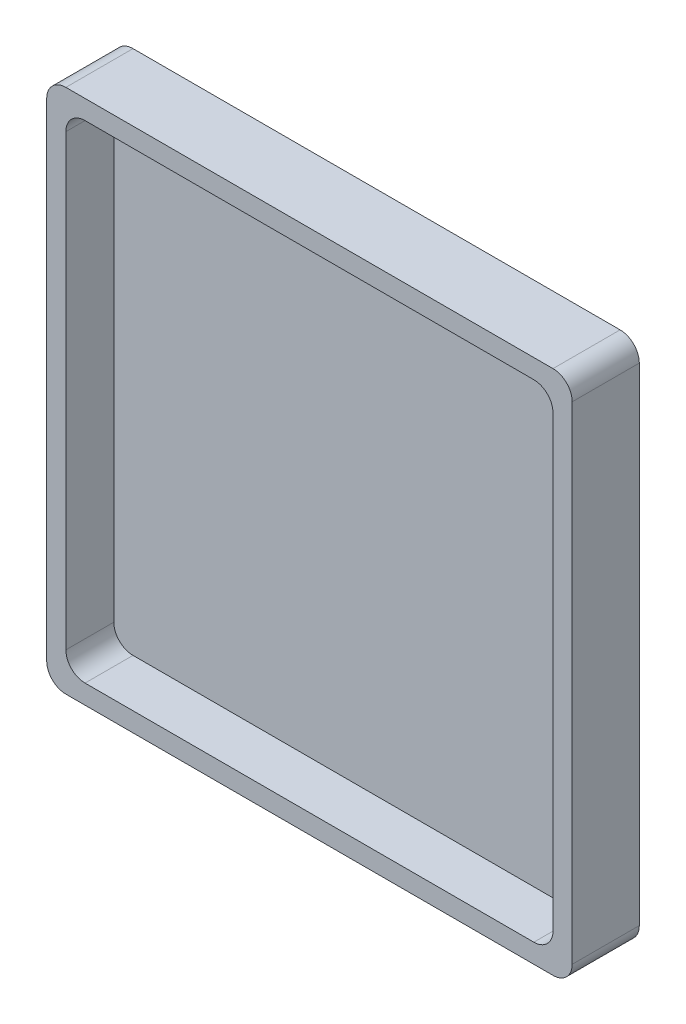
ISO-10303-21;
HEADER;
FILE_DESCRIPTION(('STEP AP214'),'2;1');
FILE_NAME('part.step','',(''),(''),'','','');
FILE_SCHEMA(('AUTOMOTIVE_DESIGN { 1 0 10303 214 1 1 1 1 }'));
ENDSEC;
DATA;
#1=APPLICATION_CONTEXT('core data for automotive mechanical design processes');
#2=APPLICATION_PROTOCOL_DEFINITION('international standard','automotive_design',2000,#1);
#3=PRODUCT_CONTEXT('',#1,'mechanical');
#4=PRODUCT('Part','Part','',(#3));
#5=PRODUCT_RELATED_PRODUCT_CATEGORY('part','',(#4));
#6=PRODUCT_DEFINITION_FORMATION('','',#4);
#7=PRODUCT_DEFINITION_CONTEXT('part definition',#1,'design');
#8=PRODUCT_DEFINITION('design','',#6,#7);
#9=PRODUCT_DEFINITION_SHAPE('','',#8);
#10=(LENGTH_UNIT() NAMED_UNIT(*) SI_UNIT(.MILLI.,.METRE.));
#11=(NAMED_UNIT(*) PLANE_ANGLE_UNIT() SI_UNIT($,.RADIAN.));
#12=(NAMED_UNIT(*) SI_UNIT($,.STERADIAN.) SOLID_ANGLE_UNIT());
#13=UNCERTAINTY_MEASURE_WITH_UNIT(LENGTH_MEASURE(1.E-05),#10,'distance_accuracy_value','');
#14=(GEOMETRIC_REPRESENTATION_CONTEXT(3) GLOBAL_UNCERTAINTY_ASSIGNED_CONTEXT((#13)) GLOBAL_UNIT_ASSIGNED_CONTEXT((#10,
#11,#12)) REPRESENTATION_CONTEXT('',''));
#15=CARTESIAN_POINT('',(0.,0.,0.));
#16=DIRECTION('',(0.,0.,1.));
#17=DIRECTION('',(1.,0.,0.));
#18=AXIS2_PLACEMENT_3D('',#15,#16,#17);
#19=CARTESIAN_POINT('',(0.,27.4,2.));
#20=DIRECTION('',(0.,1.,0.));
#21=DIRECTION('',(0.,0.,1.));
#22=AXIS2_PLACEMENT_3D('',#19,#20,#21);
#23=PLANE('',#22);
#24=DIRECTION('',(-1.,0.,0.));
#25=VECTOR('',#24,1.);
#26=CARTESIAN_POINT('',(27.4,27.4,7.));
#27=LINE('',#26,#25);
#28=CARTESIAN_POINT('',(25.4,27.4,7.));
#29=VERTEX_POINT('',#28);
#30=CARTESIAN_POINT('',(-25.4,27.4,7.));
#31=VERTEX_POINT('',#30);
#32=EDGE_CURVE('E263',#29,#31,#27,.T.);
#33=ORIENTED_EDGE('',*,*,#32,.F.);
#34=DIRECTION('',(0.,0.,-1.));
#35=VECTOR('',#34,1.);
#36=CARTESIAN_POINT('',(25.4,27.4,2.));
#37=LINE('',#36,#35);
#38=CARTESIAN_POINT('',(25.4,27.4,0.));
#39=VERTEX_POINT('',#38);
#40=EDGE_CURVE('E211',#29,#39,#37,.T.);
#41=ORIENTED_EDGE('',*,*,#40,.T.);
#42=DIRECTION('',(1.,0.,0.));
#43=VECTOR('',#42,1.);
#44=CARTESIAN_POINT('',(0.,27.4,0.));
#45=LINE('',#44,#43);
#46=CARTESIAN_POINT('',(-25.4,27.4,0.));
#47=VERTEX_POINT('',#46);
#48=EDGE_CURVE('E285',#47,#39,#45,.T.);
#49=ORIENTED_EDGE('',*,*,#48,.F.);
#50=DIRECTION('',(0.,0.,-1.));
#51=VECTOR('',#50,1.);
#52=CARTESIAN_POINT('',(-25.4,27.4,7.));
#53=LINE('',#52,#51);
#54=EDGE_CURVE('E209',#47,#31,#53,.F.);
#55=ORIENTED_EDGE('',*,*,#54,.T.);
#56=EDGE_LOOP('',(#33,#41,#49,#55));
#57=FACE_BOUND('',#56,.T.);
#58=ADVANCED_FACE('F43',(#57),#23,.T.);
#59=CARTESIAN_POINT('',(-27.4,0.,2.));
#60=DIRECTION('',(1.,0.,0.));
#61=DIRECTION('',(0.,1.,0.));
#62=AXIS2_PLACEMENT_3D('',#59,#60,#61);
#63=PLANE('',#62);
#64=DIRECTION('',(0.,-1.,0.));
#65=VECTOR('',#64,1.);
#66=CARTESIAN_POINT('',(-27.4,27.4,7.));
#67=LINE('',#66,#65);
#68=CARTESIAN_POINT('',(-27.4,25.4,7.));
#69=VERTEX_POINT('',#68);
#70=CARTESIAN_POINT('',(-27.4,-25.4,7.));
#71=VERTEX_POINT('',#70);
#72=EDGE_CURVE('E278',#69,#71,#67,.T.);
#73=ORIENTED_EDGE('',*,*,#72,.F.);
#74=DIRECTION('',(0.,0.,-1.));
#75=VECTOR('',#74,1.);
#76=CARTESIAN_POINT('',(-27.4,25.4,0.));
#77=LINE('',#76,#75);
#78=CARTESIAN_POINT('',(-27.4,25.4,0.));
#79=VERTEX_POINT('',#78);
#80=EDGE_CURVE('E236',#69,#79,#77,.T.);
#81=ORIENTED_EDGE('',*,*,#80,.T.);
#82=DIRECTION('',(0.,-1.,0.));
#83=VECTOR('',#82,1.);
#84=CARTESIAN_POINT('',(-27.4,0.,0.));
#85=LINE('',#84,#83);
#86=CARTESIAN_POINT('',(-27.4,-25.4,0.));
#87=VERTEX_POINT('',#86);
#88=EDGE_CURVE('E288',#79,#87,#85,.T.);
#89=ORIENTED_EDGE('',*,*,#88,.T.);
#90=DIRECTION('',(0.,0.,-1.));
#91=VECTOR('',#90,1.);
#92=CARTESIAN_POINT('',(-27.4,-25.4,2.));
#93=LINE('',#92,#91);
#94=EDGE_CURVE('E234',#87,#71,#93,.F.);
#95=ORIENTED_EDGE('',*,*,#94,.T.);
#96=EDGE_LOOP('',(#73,#81,#89,#95));
#97=FACE_BOUND('',#96,.T.);
#98=ADVANCED_FACE('F316',(#97),#63,.F.);
#99=CARTESIAN_POINT('',(0.,-27.4,2.));
#100=DIRECTION('',(0.,1.,0.));
#101=DIRECTION('',(0.,0.,1.));
#102=AXIS2_PLACEMENT_3D('',#99,#100,#101);
#103=PLANE('',#102);
#104=DIRECTION('',(1.,0.,0.));
#105=VECTOR('',#104,1.);
#106=CARTESIAN_POINT('',(-27.4,-27.4,7.));
#107=LINE('',#106,#105);
#108=CARTESIAN_POINT('',(-25.4,-27.4,7.));
#109=VERTEX_POINT('',#108);
#110=CARTESIAN_POINT('',(25.4,-27.4,7.));
#111=VERTEX_POINT('',#110);
#112=EDGE_CURVE('E280',#109,#111,#107,.T.);
#113=ORIENTED_EDGE('',*,*,#112,.F.);
#114=DIRECTION('',(0.,0.,-1.));
#115=VECTOR('',#114,1.);
#116=CARTESIAN_POINT('',(-25.4,-27.4,2.));
#117=LINE('',#116,#115);
#118=CARTESIAN_POINT('',(-25.4,-27.4,0.));
#119=VERTEX_POINT('',#118);
#120=EDGE_CURVE('E240',#109,#119,#117,.T.);
#121=ORIENTED_EDGE('',*,*,#120,.T.);
#122=DIRECTION('',(1.,0.,0.));
#123=VECTOR('',#122,1.);
#124=CARTESIAN_POINT('',(0.,-27.4,0.));
#125=LINE('',#124,#123);
#126=CARTESIAN_POINT('',(25.4,-27.4,0.));
#127=VERTEX_POINT('',#126);
#128=EDGE_CURVE('E188',#119,#127,#125,.T.);
#129=ORIENTED_EDGE('',*,*,#128,.T.);
#130=DIRECTION('',(0.,0.,-1.));
#131=VECTOR('',#130,1.);
#132=CARTESIAN_POINT('',(25.4,-27.4,7.));
#133=LINE('',#132,#131);
#134=EDGE_CURVE('E58',#127,#111,#133,.F.);
#135=ORIENTED_EDGE('',*,*,#134,.T.);
#136=EDGE_LOOP('',(#113,#121,#129,#135));
#137=FACE_BOUND('',#136,.T.);
#138=ADVANCED_FACE('F291',(#137),#103,.F.);
#139=CARTESIAN_POINT('',(27.4,0.,2.));
#140=DIRECTION('',(1.,0.,0.));
#141=DIRECTION('',(0.,1.,0.));
#142=AXIS2_PLACEMENT_3D('',#139,#140,#141);
#143=PLANE('',#142);
#144=DIRECTION('',(0.,-1.,0.));
#145=VECTOR('',#144,1.);
#146=CARTESIAN_POINT('',(27.4,0.,0.));
#147=LINE('',#146,#145);
#148=CARTESIAN_POINT('',(27.4,25.4,0.));
#149=VERTEX_POINT('',#148);
#150=CARTESIAN_POINT('',(27.4,-25.4,0.));
#151=VERTEX_POINT('',#150);
#152=EDGE_CURVE('E183',#149,#151,#147,.T.);
#153=ORIENTED_EDGE('',*,*,#152,.F.);
#154=DIRECTION('',(0.,0.,-1.));
#155=VECTOR('',#154,1.);
#156=CARTESIAN_POINT('',(27.4,25.4,2.));
#157=LINE('',#156,#155);
#158=CARTESIAN_POINT('',(27.4,25.4,7.));
#159=VERTEX_POINT('',#158);
#160=EDGE_CURVE('E225',#149,#159,#157,.F.);
#161=ORIENTED_EDGE('',*,*,#160,.T.);
#162=DIRECTION('',(0.,1.,0.));
#163=VECTOR('',#162,1.);
#164=CARTESIAN_POINT('',(27.4,-27.4,7.));
#165=LINE('',#164,#163);
#166=CARTESIAN_POINT('',(27.4,-25.4,7.));
#167=VERTEX_POINT('',#166);
#168=EDGE_CURVE('E282',#167,#159,#165,.T.);
#169=ORIENTED_EDGE('',*,*,#168,.F.);
#170=DIRECTION('',(0.,0.,-1.));
#171=VECTOR('',#170,1.);
#172=CARTESIAN_POINT('',(27.4,-25.4,0.));
#173=LINE('',#172,#171);
#174=EDGE_CURVE('E222',#167,#151,#173,.T.);
#175=ORIENTED_EDGE('',*,*,#174,.T.);
#176=EDGE_LOOP('',(#153,#161,#169,#175));
#177=FACE_BOUND('',#176,.T.);
#178=ADVANCED_FACE('F301',(#177),#143,.T.);
#179=CARTESIAN_POINT('',(0.,0.,0.));
#180=DIRECTION('',(0.,0.,1.));
#181=DIRECTION('',(1.,0.,0.));
#182=AXIS2_PLACEMENT_3D('',#179,#180,#181);
#183=PLANE('',#182);
#184=ORIENTED_EDGE('',*,*,#48,.T.);
#185=CARTESIAN_POINT('',(25.4,25.4,0.));
#186=DIRECTION('',(0.,0.,1.));
#187=DIRECTION('',(1.,0.,0.));
#188=AXIS2_PLACEMENT_3D('',#185,#186,#187);
#189=CIRCLE('',#188,2.);
#190=EDGE_CURVE('E220',#39,#149,#189,.F.);
#191=ORIENTED_EDGE('',*,*,#190,.T.);
#192=ORIENTED_EDGE('',*,*,#152,.T.);
#193=CARTESIAN_POINT('',(25.4,-25.4,0.));
#194=DIRECTION('',(0.,0.,1.));
#195=DIRECTION('',(1.,0.,0.));
#196=AXIS2_PLACEMENT_3D('',#193,#194,#195);
#197=CIRCLE('',#196,2.);
#198=EDGE_CURVE('E214',#151,#127,#197,.F.);
#199=ORIENTED_EDGE('',*,*,#198,.T.);
#200=ORIENTED_EDGE('',*,*,#128,.F.);
#201=CARTESIAN_POINT('',(-25.4,-25.4,0.));
#202=DIRECTION('',(0.,0.,1.));
#203=DIRECTION('',(1.,0.,0.));
#204=AXIS2_PLACEMENT_3D('',#201,#202,#203);
#205=CIRCLE('',#204,2.);
#206=EDGE_CURVE('E216',#119,#87,#205,.F.);
#207=ORIENTED_EDGE('',*,*,#206,.T.);
#208=ORIENTED_EDGE('',*,*,#88,.F.);
#209=CARTESIAN_POINT('',(-25.4,25.4,0.));
#210=DIRECTION('',(0.,0.,1.));
#211=DIRECTION('',(1.,0.,0.));
#212=AXIS2_PLACEMENT_3D('',#209,#210,#211);
#213=CIRCLE('',#212,2.);
#214=EDGE_CURVE('E218',#79,#47,#213,.F.);
#215=ORIENTED_EDGE('',*,*,#214,.T.);
#216=EDGE_LOOP('',(#184,#191,#192,#199,#200,#207,#208,#215));
#217=FACE_BOUND('',#216,.T.);
#218=ADVANCED_FACE('F321',(#217),#183,.F.);
#219=CARTESIAN_POINT('',(0.,0.,7.));
#220=DIRECTION('',(0.,0.,1.));
#221=DIRECTION('',(1.,0.,0.));
#222=AXIS2_PLACEMENT_3D('',#219,#220,#221);
#223=PLANE('',#222);
#224=ORIENTED_EDGE('',*,*,#168,.T.);
#225=CARTESIAN_POINT('',(25.4,25.4,7.));
#226=DIRECTION('',(0.,0.,1.));
#227=DIRECTION('',(1.,0.,0.));
#228=AXIS2_PLACEMENT_3D('',#225,#226,#227);
#229=CIRCLE('',#228,2.);
#230=EDGE_CURVE('E232',#159,#29,#229,.T.);
#231=ORIENTED_EDGE('',*,*,#230,.T.);
#232=ORIENTED_EDGE('',*,*,#32,.T.);
#233=CARTESIAN_POINT('',(-25.4,25.4,7.));
#234=DIRECTION('',(0.,0.,1.));
#235=DIRECTION('',(1.,0.,0.));
#236=AXIS2_PLACEMENT_3D('',#233,#234,#235);
#237=CIRCLE('',#236,2.);
#238=EDGE_CURVE('E230',#31,#69,#237,.T.);
#239=ORIENTED_EDGE('',*,*,#238,.T.);
#240=ORIENTED_EDGE('',*,*,#72,.T.);
#241=CARTESIAN_POINT('',(-25.4,-25.4,7.));
#242=DIRECTION('',(0.,0.,1.));
#243=DIRECTION('',(1.,0.,0.));
#244=AXIS2_PLACEMENT_3D('',#241,#242,#243);
#245=CIRCLE('',#244,2.);
#246=EDGE_CURVE('E65',#71,#109,#245,.T.);
#247=ORIENTED_EDGE('',*,*,#246,.T.);
#248=ORIENTED_EDGE('',*,*,#112,.T.);
#249=CARTESIAN_POINT('',(25.4,-25.4,7.));
#250=DIRECTION('',(0.,0.,1.));
#251=DIRECTION('',(1.,0.,0.));
#252=AXIS2_PLACEMENT_3D('',#249,#250,#251);
#253=CIRCLE('',#252,2.);
#254=EDGE_CURVE('E227',#111,#167,#253,.T.);
#255=ORIENTED_EDGE('',*,*,#254,.T.);
#256=EDGE_LOOP('',(#224,#231,#232,#239,#240,#247,#248,#255));
#257=FACE_BOUND('',#256,.T.);
#258=DIRECTION('',(1.,0.,0.));
#259=VECTOR('',#258,1.);
#260=CARTESIAN_POINT('',(-25.4,-25.4,7.));
#261=LINE('',#260,#259);
#262=CARTESIAN_POINT('',(-23.4,-25.4,7.));
#263=VERTEX_POINT('',#262);
#264=CARTESIAN_POINT('',(23.4,-25.4,7.));
#265=VERTEX_POINT('',#264);
#266=EDGE_CURVE('E496',#263,#265,#261,.T.);
#267=ORIENTED_EDGE('',*,*,#266,.F.);
#268=CARTESIAN_POINT('',(-23.4,-23.4,7.));
#269=DIRECTION('',(0.,0.,1.));
#270=DIRECTION('',(1.,0.,0.));
#271=AXIS2_PLACEMENT_3D('',#268,#269,#270);
#272=CIRCLE('',#271,2.);
#273=CARTESIAN_POINT('',(-25.4,-23.4,7.));
#274=VERTEX_POINT('',#273);
#275=EDGE_CURVE('E182',#263,#274,#272,.F.);
#276=ORIENTED_EDGE('',*,*,#275,.T.);
#277=DIRECTION('',(0.,-1.,0.));
#278=VECTOR('',#277,1.);
#279=CARTESIAN_POINT('',(-25.4,25.4,7.));
#280=LINE('',#279,#278);
#281=CARTESIAN_POINT('',(-25.4,23.4,7.));
#282=VERTEX_POINT('',#281);
#283=EDGE_CURVE('E254',#282,#274,#280,.T.);
#284=ORIENTED_EDGE('',*,*,#283,.F.);
#285=CARTESIAN_POINT('',(-23.4,23.4,7.));
#286=DIRECTION('',(0.,0.,1.));
#287=DIRECTION('',(1.,0.,0.));
#288=AXIS2_PLACEMENT_3D('',#285,#286,#287);
#289=CIRCLE('',#288,2.);
#290=CARTESIAN_POINT('',(-23.4,25.4,7.));
#291=VERTEX_POINT('',#290);
#292=EDGE_CURVE('E51',#282,#291,#289,.F.);
#293=ORIENTED_EDGE('',*,*,#292,.T.);
#294=DIRECTION('',(-1.,0.,0.));
#295=VECTOR('',#294,1.);
#296=CARTESIAN_POINT('',(25.4,25.4,7.));
#297=LINE('',#296,#295);
#298=CARTESIAN_POINT('',(23.4,25.4,7.));
#299=VERTEX_POINT('',#298);
#300=EDGE_CURVE('E251',#299,#291,#297,.T.);
#301=ORIENTED_EDGE('',*,*,#300,.F.);
#302=CARTESIAN_POINT('',(23.4,23.4,7.));
#303=DIRECTION('',(0.,0.,1.));
#304=DIRECTION('',(1.,0.,0.));
#305=AXIS2_PLACEMENT_3D('',#302,#303,#304);
#306=CIRCLE('',#305,2.);
#307=CARTESIAN_POINT('',(25.4,23.4,7.));
#308=VERTEX_POINT('',#307);
#309=EDGE_CURVE('E11',#299,#308,#306,.F.);
#310=ORIENTED_EDGE('',*,*,#309,.T.);
#311=DIRECTION('',(0.,1.,0.));
#312=VECTOR('',#311,1.);
#313=CARTESIAN_POINT('',(25.4,-25.4,7.));
#314=LINE('',#313,#312);
#315=CARTESIAN_POINT('',(25.4,-23.4,7.));
#316=VERTEX_POINT('',#315);
#317=EDGE_CURVE('E264',#316,#308,#314,.T.);
#318=ORIENTED_EDGE('',*,*,#317,.F.);
#319=CARTESIAN_POINT('',(23.4,-23.4,7.));
#320=DIRECTION('',(0.,0.,1.));
#321=DIRECTION('',(1.,0.,0.));
#322=AXIS2_PLACEMENT_3D('',#319,#320,#321);
#323=CIRCLE('',#322,2.);
#324=EDGE_CURVE('E243',#316,#265,#323,.F.);
#325=ORIENTED_EDGE('',*,*,#324,.T.);
#326=EDGE_LOOP('',(#267,#276,#284,#293,#301,#310,#318,#325));
#327=FACE_BOUND('',#326,.T.);
#328=ADVANCED_FACE('F250',(#257,#327),#223,.T.);
#329=CARTESIAN_POINT('',(-25.4,25.4,7.));
#330=DIRECTION('',(1.,0.,0.));
#331=DIRECTION('',(0.,1.,0.));
#332=AXIS2_PLACEMENT_3D('',#329,#330,#331);
#333=PLANE('',#332);
#334=ORIENTED_EDGE('',*,*,#283,.T.);
#335=DIRECTION('',(0.,0.,-1.));
#336=VECTOR('',#335,1.);
#337=CARTESIAN_POINT('',(-25.4,-23.4,2.));
#338=LINE('',#337,#336);
#339=CARTESIAN_POINT('',(-25.4,-23.4,2.));
#340=VERTEX_POINT('',#339);
#341=EDGE_CURVE('E202',#274,#340,#338,.T.);
#342=ORIENTED_EDGE('',*,*,#341,.T.);
#343=DIRECTION('',(0.,-1.,0.));
#344=VECTOR('',#343,1.);
#345=CARTESIAN_POINT('',(-25.4,25.4,2.));
#346=LINE('',#345,#344);
#347=CARTESIAN_POINT('',(-25.4,23.4,2.));
#348=VERTEX_POINT('',#347);
#349=EDGE_CURVE('E162',#348,#340,#346,.T.);
#350=ORIENTED_EDGE('',*,*,#349,.F.);
#351=DIRECTION('',(0.,0.,-1.));
#352=VECTOR('',#351,1.);
#353=CARTESIAN_POINT('',(-25.4,23.4,7.));
#354=LINE('',#353,#352);
#355=EDGE_CURVE('E200',#348,#282,#354,.F.);
#356=ORIENTED_EDGE('',*,*,#355,.T.);
#357=EDGE_LOOP('',(#334,#342,#350,#356));
#358=FACE_BOUND('',#357,.T.);
#359=ADVANCED_FACE('F269',(#358),#333,.T.);
#360=CARTESIAN_POINT('',(-25.4,-25.4,7.));
#361=DIRECTION('',(0.,1.,0.));
#362=DIRECTION('',(0.,0.,1.));
#363=AXIS2_PLACEMENT_3D('',#360,#361,#362);
#364=PLANE('',#363);
#365=ORIENTED_EDGE('',*,*,#266,.T.);
#366=DIRECTION('',(0.,0.,-1.));
#367=VECTOR('',#366,1.);
#368=CARTESIAN_POINT('',(23.4,-25.4,2.));
#369=LINE('',#368,#367);
#370=CARTESIAN_POINT('',(23.4,-25.4,2.));
#371=VERTEX_POINT('',#370);
#372=EDGE_CURVE('E177',#265,#371,#369,.T.);
#373=ORIENTED_EDGE('',*,*,#372,.T.);
#374=DIRECTION('',(1.,0.,0.));
#375=VECTOR('',#374,1.);
#376=CARTESIAN_POINT('',(-25.4,-25.4,2.));
#377=LINE('',#376,#375);
#378=CARTESIAN_POINT('',(-23.4,-25.4,2.));
#379=VERTEX_POINT('',#378);
#380=EDGE_CURVE('E160',#379,#371,#377,.T.);
#381=ORIENTED_EDGE('',*,*,#380,.F.);
#382=DIRECTION('',(0.,0.,-1.));
#383=VECTOR('',#382,1.);
#384=CARTESIAN_POINT('',(-23.4,-25.4,7.));
#385=LINE('',#384,#383);
#386=EDGE_CURVE('E174',#379,#263,#385,.F.);
#387=ORIENTED_EDGE('',*,*,#386,.T.);
#388=EDGE_LOOP('',(#365,#373,#381,#387));
#389=FACE_BOUND('',#388,.T.);
#390=ADVANCED_FACE('F173',(#389),#364,.T.);
#391=CARTESIAN_POINT('',(25.4,-25.4,7.));
#392=DIRECTION('',(-1.,0.,0.));
#393=DIRECTION('',(0.,-1.,0.));
#394=AXIS2_PLACEMENT_3D('',#391,#392,#393);
#395=PLANE('',#394);
#396=DIRECTION('',(0.,1.,0.));
#397=VECTOR('',#396,1.);
#398=CARTESIAN_POINT('',(25.4,-25.4,2.));
#399=LINE('',#398,#397);
#400=CARTESIAN_POINT('',(25.4,-23.4,2.));
#401=VERTEX_POINT('',#400);
#402=CARTESIAN_POINT('',(25.4,23.4,2.));
#403=VERTEX_POINT('',#402);
#404=EDGE_CURVE('E178',#401,#403,#399,.T.);
#405=ORIENTED_EDGE('',*,*,#404,.F.);
#406=DIRECTION('',(0.,0.,-1.));
#407=VECTOR('',#406,1.);
#408=CARTESIAN_POINT('',(25.4,-23.4,7.));
#409=LINE('',#408,#407);
#410=EDGE_CURVE('E198',#401,#316,#409,.F.);
#411=ORIENTED_EDGE('',*,*,#410,.T.);
#412=ORIENTED_EDGE('',*,*,#317,.T.);
#413=DIRECTION('',(0.,0.,-1.));
#414=VECTOR('',#413,1.);
#415=CARTESIAN_POINT('',(25.4,23.4,2.));
#416=LINE('',#415,#414);
#417=EDGE_CURVE('E195',#308,#403,#416,.T.);
#418=ORIENTED_EDGE('',*,*,#417,.T.);
#419=EDGE_LOOP('',(#405,#411,#412,#418));
#420=FACE_BOUND('',#419,.T.);
#421=ADVANCED_FACE('F411',(#420),#395,.T.);
#422=CARTESIAN_POINT('',(25.4,25.4,7.));
#423=DIRECTION('',(0.,-1.,0.));
#424=DIRECTION('',(0.,0.,-1.));
#425=AXIS2_PLACEMENT_3D('',#422,#423,#424);
#426=PLANE('',#425);
#427=ORIENTED_EDGE('',*,*,#300,.T.);
#428=DIRECTION('',(0.,0.,-1.));
#429=VECTOR('',#428,1.);
#430=CARTESIAN_POINT('',(-23.4,25.4,2.));
#431=LINE('',#430,#429);
#432=CARTESIAN_POINT('',(-23.4,25.4,2.));
#433=VERTEX_POINT('',#432);
#434=EDGE_CURVE('E206',#291,#433,#431,.T.);
#435=ORIENTED_EDGE('',*,*,#434,.T.);
#436=DIRECTION('',(-1.,0.,0.));
#437=VECTOR('',#436,1.);
#438=CARTESIAN_POINT('',(25.4,25.4,2.));
#439=LINE('',#438,#437);
#440=CARTESIAN_POINT('',(23.4,25.4,2.));
#441=VERTEX_POINT('',#440);
#442=EDGE_CURVE('E267',#441,#433,#439,.T.);
#443=ORIENTED_EDGE('',*,*,#442,.F.);
#444=DIRECTION('',(0.,0.,-1.));
#445=VECTOR('',#444,1.);
#446=CARTESIAN_POINT('',(23.4,25.4,7.));
#447=LINE('',#446,#445);
#448=EDGE_CURVE('E204',#441,#299,#447,.F.);
#449=ORIENTED_EDGE('',*,*,#448,.T.);
#450=EDGE_LOOP('',(#427,#435,#443,#449));
#451=FACE_BOUND('',#450,.T.);
#452=ADVANCED_FACE('F259',(#451),#426,.T.);
#453=CARTESIAN_POINT('',(0.,0.,2.));
#454=DIRECTION('',(0.,0.,1.));
#455=DIRECTION('',(1.,0.,0.));
#456=AXIS2_PLACEMENT_3D('',#453,#454,#455);
#457=PLANE('',#456);
#458=ORIENTED_EDGE('',*,*,#380,.T.);
#459=CARTESIAN_POINT('',(23.4,-23.4,2.));
#460=DIRECTION('',(0.,0.,1.));
#461=DIRECTION('',(1.,0.,0.));
#462=AXIS2_PLACEMENT_3D('',#459,#460,#461);
#463=CIRCLE('',#462,2.);
#464=EDGE_CURVE('E167',#371,#401,#463,.T.);
#465=ORIENTED_EDGE('',*,*,#464,.T.);
#466=ORIENTED_EDGE('',*,*,#404,.T.);
#467=CARTESIAN_POINT('',(23.4,23.4,2.));
#468=DIRECTION('',(0.,0.,1.));
#469=DIRECTION('',(1.,0.,0.));
#470=AXIS2_PLACEMENT_3D('',#467,#468,#469);
#471=CIRCLE('',#470,2.);
#472=EDGE_CURVE('E185',#403,#441,#471,.T.);
#473=ORIENTED_EDGE('',*,*,#472,.T.);
#474=ORIENTED_EDGE('',*,*,#442,.T.);
#475=CARTESIAN_POINT('',(-23.4,23.4,2.));
#476=DIRECTION('',(0.,0.,1.));
#477=DIRECTION('',(1.,0.,0.));
#478=AXIS2_PLACEMENT_3D('',#475,#476,#477);
#479=CIRCLE('',#478,2.);
#480=EDGE_CURVE('E168',#433,#348,#479,.T.);
#481=ORIENTED_EDGE('',*,*,#480,.T.);
#482=ORIENTED_EDGE('',*,*,#349,.T.);
#483=CARTESIAN_POINT('',(-23.4,-23.4,2.));
#484=DIRECTION('',(0.,0.,1.));
#485=DIRECTION('',(1.,0.,0.));
#486=AXIS2_PLACEMENT_3D('',#483,#484,#485);
#487=CIRCLE('',#486,2.);
#488=EDGE_CURVE('E157',#340,#379,#487,.T.);
#489=ORIENTED_EDGE('',*,*,#488,.T.);
#490=EDGE_LOOP('',(#458,#465,#466,#473,#474,#481,#482,#489));
#491=FACE_BOUND('',#490,.T.);
#492=ADVANCED_FACE('F159',(#491),#457,.T.);
#493=CARTESIAN_POINT('',(23.4,-23.4,7.));
#494=DIRECTION('',(0.,0.,1.));
#495=DIRECTION('',(1.,0.,0.));
#496=AXIS2_PLACEMENT_3D('',#493,#494,#495);
#497=CYLINDRICAL_SURFACE('',#496,2.);
#498=ORIENTED_EDGE('',*,*,#324,.F.);
#499=ORIENTED_EDGE('',*,*,#410,.F.);
#500=ORIENTED_EDGE('',*,*,#464,.F.);
#501=ORIENTED_EDGE('',*,*,#372,.F.);
#502=EDGE_LOOP('',(#498,#499,#500,#501));
#503=FACE_BOUND('',#502,.T.);
#504=ADVANCED_FACE('F339',(#503),#497,.F.);
#505=CARTESIAN_POINT('',(-23.4,-23.4,7.));
#506=DIRECTION('',(0.,0.,1.));
#507=DIRECTION('',(1.,0.,0.));
#508=AXIS2_PLACEMENT_3D('',#505,#506,#507);
#509=CYLINDRICAL_SURFACE('',#508,2.);
#510=ORIENTED_EDGE('',*,*,#275,.F.);
#511=ORIENTED_EDGE('',*,*,#386,.F.);
#512=ORIENTED_EDGE('',*,*,#488,.F.);
#513=ORIENTED_EDGE('',*,*,#341,.F.);
#514=EDGE_LOOP('',(#510,#511,#512,#513));
#515=FACE_BOUND('',#514,.T.);
#516=ADVANCED_FACE('F181',(#515),#509,.F.);
#517=CARTESIAN_POINT('',(-23.4,23.4,7.));
#518=DIRECTION('',(0.,0.,1.));
#519=DIRECTION('',(1.,0.,0.));
#520=AXIS2_PLACEMENT_3D('',#517,#518,#519);
#521=CYLINDRICAL_SURFACE('',#520,2.);
#522=ORIENTED_EDGE('',*,*,#292,.F.);
#523=ORIENTED_EDGE('',*,*,#355,.F.);
#524=ORIENTED_EDGE('',*,*,#480,.F.);
#525=ORIENTED_EDGE('',*,*,#434,.F.);
#526=EDGE_LOOP('',(#522,#523,#524,#525));
#527=FACE_BOUND('',#526,.T.);
#528=ADVANCED_FACE('F266',(#527),#521,.F.);
#529=CARTESIAN_POINT('',(23.4,23.4,7.));
#530=DIRECTION('',(0.,0.,1.));
#531=DIRECTION('',(1.,0.,0.));
#532=AXIS2_PLACEMENT_3D('',#529,#530,#531);
#533=CYLINDRICAL_SURFACE('',#532,2.);
#534=ORIENTED_EDGE('',*,*,#309,.F.);
#535=ORIENTED_EDGE('',*,*,#448,.F.);
#536=ORIENTED_EDGE('',*,*,#472,.F.);
#537=ORIENTED_EDGE('',*,*,#417,.F.);
#538=EDGE_LOOP('',(#534,#535,#536,#537));
#539=FACE_BOUND('',#538,.T.);
#540=ADVANCED_FACE('F347',(#539),#533,.F.);
#541=CARTESIAN_POINT('',(25.4,25.4,2.));
#542=DIRECTION('',(0.,0.,-1.));
#543=DIRECTION('',(-1.,0.,0.));
#544=AXIS2_PLACEMENT_3D('',#541,#542,#543);
#545=CYLINDRICAL_SURFACE('',#544,2.);
#546=ORIENTED_EDGE('',*,*,#230,.F.);
#547=ORIENTED_EDGE('',*,*,#160,.F.);
#548=ORIENTED_EDGE('',*,*,#190,.F.);
#549=ORIENTED_EDGE('',*,*,#40,.F.);
#550=EDGE_LOOP('',(#546,#547,#548,#549));
#551=FACE_BOUND('',#550,.T.);
#552=ADVANCED_FACE('F304',(#551),#545,.T.);
#553=CARTESIAN_POINT('',(-25.4,25.4,2.));
#554=DIRECTION('',(0.,0.,1.));
#555=DIRECTION('',(1.,0.,0.));
#556=AXIS2_PLACEMENT_3D('',#553,#554,#555);
#557=CYLINDRICAL_SURFACE('',#556,2.);
#558=ORIENTED_EDGE('',*,*,#238,.F.);
#559=ORIENTED_EDGE('',*,*,#54,.F.);
#560=ORIENTED_EDGE('',*,*,#214,.F.);
#561=ORIENTED_EDGE('',*,*,#80,.F.);
#562=EDGE_LOOP('',(#558,#559,#560,#561));
#563=FACE_BOUND('',#562,.T.);
#564=ADVANCED_FACE('F312',(#563),#557,.T.);
#565=CARTESIAN_POINT('',(-25.4,-25.4,2.));
#566=DIRECTION('',(0.,0.,-1.));
#567=DIRECTION('',(-1.,0.,0.));
#568=AXIS2_PLACEMENT_3D('',#565,#566,#567);
#569=CYLINDRICAL_SURFACE('',#568,2.);
#570=ORIENTED_EDGE('',*,*,#246,.F.);
#571=ORIENTED_EDGE('',*,*,#94,.F.);
#572=ORIENTED_EDGE('',*,*,#206,.F.);
#573=ORIENTED_EDGE('',*,*,#120,.F.);
#574=EDGE_LOOP('',(#570,#571,#572,#573));
#575=FACE_BOUND('',#574,.T.);
#576=ADVANCED_FACE('F320',(#575),#569,.T.);
#577=CARTESIAN_POINT('',(25.4,-25.4,2.));
#578=DIRECTION('',(0.,0.,1.));
#579=DIRECTION('',(1.,0.,0.));
#580=AXIS2_PLACEMENT_3D('',#577,#578,#579);
#581=CYLINDRICAL_SURFACE('',#580,2.);
#582=ORIENTED_EDGE('',*,*,#254,.F.);
#583=ORIENTED_EDGE('',*,*,#134,.F.);
#584=ORIENTED_EDGE('',*,*,#198,.F.);
#585=ORIENTED_EDGE('',*,*,#174,.F.);
#586=EDGE_LOOP('',(#582,#583,#584,#585));
#587=FACE_BOUND('',#586,.T.);
#588=ADVANCED_FACE('F45',(#587),#581,.T.);
#589=CLOSED_SHELL('',(#58,#98,#138,#178,#218,#328,#359,#390,#421,#452,#492,#504,#516,#528,#540,
#552,#564,#576,#588));
#590=MANIFOLD_SOLID_BREP('B2',#589);
#591=ADVANCED_BREP_SHAPE_REPRESENTATION('',(#18,#590),#14);
#592=SHAPE_DEFINITION_REPRESENTATION(#9,#591);
ENDSEC;
END-ISO-10303-21;
